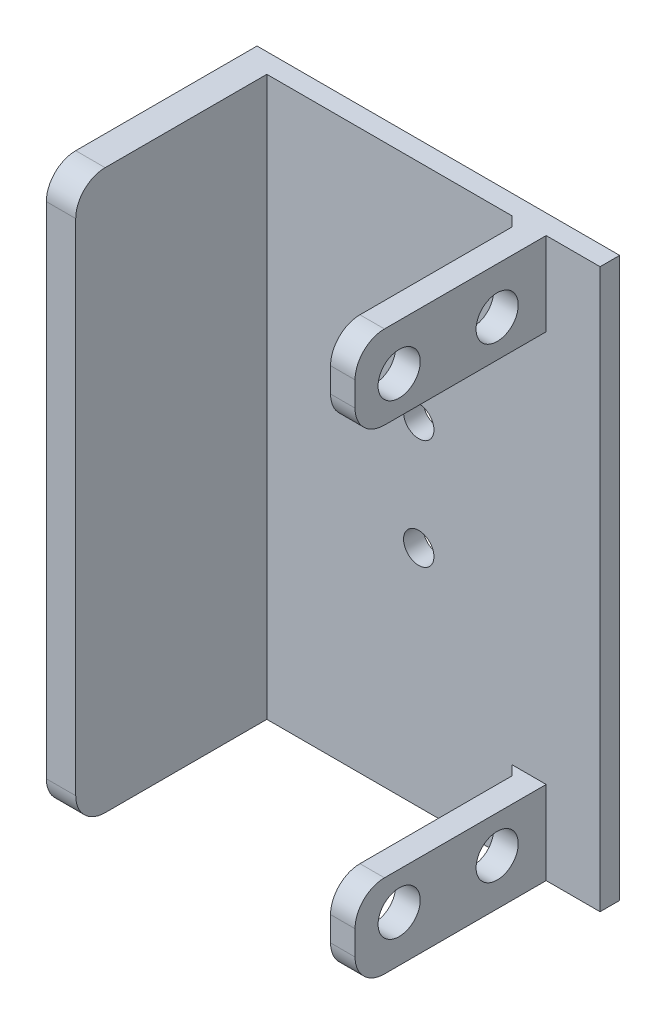
ISO-10303-21;
HEADER;
FILE_DESCRIPTION(('STEP AP214'),'2;1');
FILE_NAME('part.step','',(''),(''),'','','');
FILE_SCHEMA(('AUTOMOTIVE_DESIGN { 1 0 10303 214 1 1 1 1 }'));
ENDSEC;
DATA;
#1=APPLICATION_CONTEXT('core data for automotive mechanical design processes');
#2=APPLICATION_PROTOCOL_DEFINITION('international standard','automotive_design',2000,#1);
#3=PRODUCT_CONTEXT('',#1,'mechanical');
#4=PRODUCT('Part','Part','',(#3));
#5=PRODUCT_RELATED_PRODUCT_CATEGORY('part','',(#4));
#6=PRODUCT_DEFINITION_FORMATION('','',#4);
#7=PRODUCT_DEFINITION_CONTEXT('part definition',#1,'design');
#8=PRODUCT_DEFINITION('design','',#6,#7);
#9=PRODUCT_DEFINITION_SHAPE('','',#8);
#10=(LENGTH_UNIT() NAMED_UNIT(*) SI_UNIT(.MILLI.,.METRE.));
#11=(NAMED_UNIT(*) PLANE_ANGLE_UNIT() SI_UNIT($,.RADIAN.));
#12=(NAMED_UNIT(*) SI_UNIT($,.STERADIAN.) SOLID_ANGLE_UNIT());
#13=UNCERTAINTY_MEASURE_WITH_UNIT(LENGTH_MEASURE(1.E-05),#10,'distance_accuracy_value','');
#14=(GEOMETRIC_REPRESENTATION_CONTEXT(3) GLOBAL_UNCERTAINTY_ASSIGNED_CONTEXT((#13)) GLOBAL_UNIT_ASSIGNED_CONTEXT((#10,
#11,#12)) REPRESENTATION_CONTEXT('',''));
#15=CARTESIAN_POINT('',(0.,0.,0.));
#16=DIRECTION('',(0.,0.,1.));
#17=DIRECTION('',(1.,0.,0.));
#18=AXIS2_PLACEMENT_3D('',#15,#16,#17);
#19=CARTESIAN_POINT('',(0.,0.,2.));
#20=DIRECTION('',(0.,0.,1.));
#21=DIRECTION('',(1.,0.,0.));
#22=AXIS2_PLACEMENT_3D('',#19,#20,#21);
#23=PLANE('',#22);
#24=DIRECTION('',(1.,0.,0.));
#25=VECTOR('',#24,1.);
#26=CARTESIAN_POINT('',(-18.5,-28.5,2.));
#27=LINE('',#26,#25);
#28=CARTESIAN_POINT('',(-15.5,-28.5,2.));
#29=VERTEX_POINT('',#28);
#30=CARTESIAN_POINT('',(9.49999999999999,-28.5,2.));
#31=VERTEX_POINT('',#30);
#32=EDGE_CURVE('E218',#29,#31,#27,.T.);
#33=ORIENTED_EDGE('',*,*,#32,.T.);
#34=DIRECTION('',(0.,1.,0.));
#35=VECTOR('',#34,1.);
#36=CARTESIAN_POINT('',(9.49999999999999,0.,2.));
#37=LINE('',#36,#35);
#38=CARTESIAN_POINT('',(9.49999999999999,-20.,2.));
#39=VERTEX_POINT('',#38);
#40=EDGE_CURVE('E322',#31,#39,#37,.T.);
#41=ORIENTED_EDGE('',*,*,#40,.T.);
#42=DIRECTION('',(-1.,0.,0.));
#43=VECTOR('',#42,1.);
#44=CARTESIAN_POINT('',(13.,-20.,2.));
#45=LINE('',#44,#43);
#46=CARTESIAN_POINT('',(13.,-20.,2.));
#47=VERTEX_POINT('',#46);
#48=EDGE_CURVE('E211',#47,#39,#45,.T.);
#49=ORIENTED_EDGE('',*,*,#48,.F.);
#50=DIRECTION('',(0.,1.,0.));
#51=VECTOR('',#50,1.);
#52=CARTESIAN_POINT('',(13.,-28.5,2.));
#53=LINE('',#52,#51);
#54=CARTESIAN_POINT('',(13.,-28.5,2.));
#55=VERTEX_POINT('',#54);
#56=EDGE_CURVE('E194',#55,#47,#53,.T.);
#57=ORIENTED_EDGE('',*,*,#56,.F.);
#58=CARTESIAN_POINT('',(18.5,-28.5,2.));
#59=VERTEX_POINT('',#58);
#60=EDGE_CURVE('E208',#55,#59,#27,.T.);
#61=ORIENTED_EDGE('',*,*,#60,.T.);
#62=DIRECTION('',(0.,1.,0.));
#63=VECTOR('',#62,1.);
#64=CARTESIAN_POINT('',(18.5,28.5,2.));
#65=LINE('',#64,#63);
#66=CARTESIAN_POINT('',(18.5,28.5,2.));
#67=VERTEX_POINT('',#66);
#68=EDGE_CURVE('E238',#59,#67,#65,.T.);
#69=ORIENTED_EDGE('',*,*,#68,.T.);
#70=DIRECTION('',(-1.,0.,0.));
#71=VECTOR('',#70,1.);
#72=CARTESIAN_POINT('',(-18.5,28.5,2.));
#73=LINE('',#72,#71);
#74=CARTESIAN_POINT('',(13.,28.5,2.));
#75=VERTEX_POINT('',#74);
#76=EDGE_CURVE('E219',#67,#75,#73,.T.);
#77=ORIENTED_EDGE('',*,*,#76,.T.);
#78=DIRECTION('',(0.,1.,0.));
#79=VECTOR('',#78,1.);
#80=CARTESIAN_POINT('',(13.,28.5,2.));
#81=LINE('',#80,#79);
#82=CARTESIAN_POINT('',(13.,20.,2.));
#83=VERTEX_POINT('',#82);
#84=EDGE_CURVE('E376',#83,#75,#81,.T.);
#85=ORIENTED_EDGE('',*,*,#84,.F.);
#86=DIRECTION('',(1.,0.,0.));
#87=VECTOR('',#86,1.);
#88=CARTESIAN_POINT('',(10.5,20.,2.));
#89=LINE('',#88,#87);
#90=CARTESIAN_POINT('',(9.49999999999999,20.,2.));
#91=VERTEX_POINT('',#90);
#92=EDGE_CURVE('E334',#91,#83,#89,.T.);
#93=ORIENTED_EDGE('',*,*,#92,.F.);
#94=DIRECTION('',(0.,1.,0.));
#95=VECTOR('',#94,1.);
#96=CARTESIAN_POINT('',(9.5,0.,2.));
#97=LINE('',#96,#95);
#98=CARTESIAN_POINT('',(9.49999999999999,28.5,2.));
#99=VERTEX_POINT('',#98);
#100=EDGE_CURVE('E320',#91,#99,#97,.T.);
#101=ORIENTED_EDGE('',*,*,#100,.T.);
#102=CARTESIAN_POINT('',(-15.5,28.5,2.));
#103=VERTEX_POINT('',#102);
#104=EDGE_CURVE('E222',#99,#103,#73,.T.);
#105=ORIENTED_EDGE('',*,*,#104,.T.);
#106=DIRECTION('',(0.,1.,0.));
#107=VECTOR('',#106,1.);
#108=CARTESIAN_POINT('',(-15.5,28.5,2.));
#109=LINE('',#108,#107);
#110=EDGE_CURVE('E201',#29,#103,#109,.T.);
#111=ORIENTED_EDGE('',*,*,#110,.F.);
#112=EDGE_LOOP('',(#33,#41,#49,#57,#61,#69,#77,#85,#93,#101,#105,#111));
#113=FACE_BOUND('',#112,.T.);
#114=CARTESIAN_POINT('',(0.,-5.6,2.));
#115=DIRECTION('',(0.,0.,1.));
#116=DIRECTION('',(1.,0.,0.));
#117=AXIS2_PLACEMENT_3D('',#114,#115,#116);
#118=CIRCLE('',#117,1.55);
#119=CARTESIAN_POINT('',(1.55,-5.6,2.));
#120=VERTEX_POINT('',#119);
#121=EDGE_CURVE('E389',#120,#120,#118,.T.);
#122=ORIENTED_EDGE('',*,*,#121,.F.);
#123=EDGE_LOOP('',(#122));
#124=FACE_BOUND('',#123,.T.);
#125=CARTESIAN_POINT('',(0.,5.6,2.));
#126=DIRECTION('',(0.,0.,1.));
#127=DIRECTION('',(1.,0.,0.));
#128=AXIS2_PLACEMENT_3D('',#125,#126,#127);
#129=CIRCLE('',#128,1.55);
#130=CARTESIAN_POINT('',(1.55,5.6,2.));
#131=VERTEX_POINT('',#130);
#132=EDGE_CURVE('E392',#131,#131,#129,.F.);
#133=ORIENTED_EDGE('',*,*,#132,.T.);
#134=EDGE_LOOP('',(#133));
#135=FACE_BOUND('',#134,.T.);
#136=ADVANCED_FACE('F39',(#113,#124,#135),#23,.T.);
#137=CARTESIAN_POINT('',(0.,0.,0.));
#138=DIRECTION('',(0.,0.,1.));
#139=DIRECTION('',(1.,0.,0.));
#140=AXIS2_PLACEMENT_3D('',#137,#138,#139);
#141=PLANE('',#140);
#142=CARTESIAN_POINT('',(0.,-5.6,0.));
#143=DIRECTION('',(0.,0.,1.));
#144=DIRECTION('',(1.,0.,0.));
#145=AXIS2_PLACEMENT_3D('',#142,#143,#144);
#146=CIRCLE('',#145,1.55);
#147=CARTESIAN_POINT('',(1.55,-5.6,0.));
#148=VERTEX_POINT('',#147);
#149=EDGE_CURVE('E386',#148,#148,#146,.T.);
#150=ORIENTED_EDGE('',*,*,#149,.T.);
#151=EDGE_LOOP('',(#150));
#152=FACE_BOUND('',#151,.T.);
#153=DIRECTION('',(0.,1.,0.));
#154=VECTOR('',#153,1.);
#155=CARTESIAN_POINT('',(18.5,28.5,0.));
#156=LINE('',#155,#154);
#157=CARTESIAN_POINT('',(18.5,-28.5,0.));
#158=VERTEX_POINT('',#157);
#159=CARTESIAN_POINT('',(18.5,28.5,0.));
#160=VERTEX_POINT('',#159);
#161=EDGE_CURVE('E226',#158,#160,#156,.T.);
#162=ORIENTED_EDGE('',*,*,#161,.F.);
#163=DIRECTION('',(1.,0.,0.));
#164=VECTOR('',#163,1.);
#165=CARTESIAN_POINT('',(-18.5,-28.5,0.));
#166=LINE('',#165,#164);
#167=CARTESIAN_POINT('',(-18.5,-28.5,0.));
#168=VERTEX_POINT('',#167);
#169=EDGE_CURVE('E236',#168,#158,#166,.T.);
#170=ORIENTED_EDGE('',*,*,#169,.F.);
#171=DIRECTION('',(0.,-1.,0.));
#172=VECTOR('',#171,1.);
#173=CARTESIAN_POINT('',(-18.5,28.5,0.));
#174=LINE('',#173,#172);
#175=CARTESIAN_POINT('',(-18.5,28.5,0.));
#176=VERTEX_POINT('',#175);
#177=EDGE_CURVE('E233',#176,#168,#174,.T.);
#178=ORIENTED_EDGE('',*,*,#177,.F.);
#179=DIRECTION('',(-1.,0.,0.));
#180=VECTOR('',#179,1.);
#181=CARTESIAN_POINT('',(-18.5,28.5,0.));
#182=LINE('',#181,#180);
#183=EDGE_CURVE('E229',#160,#176,#182,.T.);
#184=ORIENTED_EDGE('',*,*,#183,.F.);
#185=EDGE_LOOP('',(#162,#170,#178,#184));
#186=FACE_BOUND('',#185,.T.);
#187=CARTESIAN_POINT('',(0.,5.6,0.));
#188=DIRECTION('',(0.,0.,1.));
#189=DIRECTION('',(1.,0.,0.));
#190=AXIS2_PLACEMENT_3D('',#187,#188,#189);
#191=CIRCLE('',#190,1.55);
#192=CARTESIAN_POINT('',(1.55,5.6,0.));
#193=VERTEX_POINT('',#192);
#194=EDGE_CURVE('E381',#193,#193,#191,.F.);
#195=ORIENTED_EDGE('',*,*,#194,.F.);
#196=EDGE_LOOP('',(#195));
#197=FACE_BOUND('',#196,.T.);
#198=ADVANCED_FACE('F469',(#152,#186,#197),#141,.F.);
#199=CARTESIAN_POINT('',(18.5,28.5,2.));
#200=DIRECTION('',(-1.,0.,0.));
#201=DIRECTION('',(0.,-1.,0.));
#202=AXIS2_PLACEMENT_3D('',#199,#200,#201);
#203=PLANE('',#202);
#204=ORIENTED_EDGE('',*,*,#161,.T.);
#205=DIRECTION('',(0.,0.,-1.));
#206=VECTOR('',#205,1.);
#207=CARTESIAN_POINT('',(18.5,28.5,2.));
#208=LINE('',#207,#206);
#209=EDGE_CURVE('E244',#67,#160,#208,.T.);
#210=ORIENTED_EDGE('',*,*,#209,.F.);
#211=ORIENTED_EDGE('',*,*,#68,.F.);
#212=DIRECTION('',(0.,0.,-1.));
#213=VECTOR('',#212,1.);
#214=CARTESIAN_POINT('',(18.5,-28.5,2.));
#215=LINE('',#214,#213);
#216=EDGE_CURVE('E216',#59,#158,#215,.T.);
#217=ORIENTED_EDGE('',*,*,#216,.T.);
#218=EDGE_LOOP('',(#204,#210,#211,#217));
#219=FACE_BOUND('',#218,.T.);
#220=ADVANCED_FACE('F472',(#219),#203,.F.);
#221=CARTESIAN_POINT('',(-18.5,28.5,2.));
#222=DIRECTION('',(0.,-1.,0.));
#223=DIRECTION('',(0.,0.,-1.));
#224=AXIS2_PLACEMENT_3D('',#221,#222,#223);
#225=PLANE('',#224);
#226=DIRECTION('',(0.,0.,-1.));
#227=VECTOR('',#226,1.);
#228=CARTESIAN_POINT('',(10.5,28.5,21.5));
#229=LINE('',#228,#227);
#230=CARTESIAN_POINT('',(10.5,28.5,18.5));
#231=VERTEX_POINT('',#230);
#232=CARTESIAN_POINT('',(10.5,28.5,3.00000000000002));
#233=VERTEX_POINT('',#232);
#234=EDGE_CURVE('E372',#231,#233,#229,.T.);
#235=ORIENTED_EDGE('',*,*,#234,.F.);
#236=DIRECTION('',(-1.,0.,0.));
#237=VECTOR('',#236,1.);
#238=CARTESIAN_POINT('',(-18.5,28.5,18.5));
#239=LINE('',#238,#237);
#240=CARTESIAN_POINT('',(13.,28.5,18.5));
#241=VERTEX_POINT('',#240);
#242=EDGE_CURVE('E276',#231,#241,#239,.F.);
#243=ORIENTED_EDGE('',*,*,#242,.T.);
#244=DIRECTION('',(0.,0.,-1.));
#245=VECTOR('',#244,1.);
#246=CARTESIAN_POINT('',(13.,28.5,21.5));
#247=LINE('',#246,#245);
#248=EDGE_CURVE('E370',#241,#75,#247,.T.);
#249=ORIENTED_EDGE('',*,*,#248,.T.);
#250=ORIENTED_EDGE('',*,*,#76,.F.);
#251=ORIENTED_EDGE('',*,*,#209,.T.);
#252=ORIENTED_EDGE('',*,*,#183,.T.);
#253=DIRECTION('',(0.,0.,-1.));
#254=VECTOR('',#253,1.);
#255=CARTESIAN_POINT('',(-18.5,28.5,2.));
#256=LINE('',#255,#254);
#257=CARTESIAN_POINT('',(-18.5,28.5,18.5));
#258=VERTEX_POINT('',#257);
#259=EDGE_CURVE('E242',#258,#176,#256,.T.);
#260=ORIENTED_EDGE('',*,*,#259,.F.);
#261=DIRECTION('',(-1.,0.,0.));
#262=VECTOR('',#261,1.);
#263=CARTESIAN_POINT('',(-15.5,28.5,18.5));
#264=LINE('',#263,#262);
#265=CARTESIAN_POINT('',(-15.5,28.5,18.5));
#266=VERTEX_POINT('',#265);
#267=EDGE_CURVE('E274',#258,#266,#264,.F.);
#268=ORIENTED_EDGE('',*,*,#267,.T.);
#269=DIRECTION('',(0.,0.,-1.));
#270=VECTOR('',#269,1.);
#271=CARTESIAN_POINT('',(-15.5,28.5,21.5));
#272=LINE('',#271,#270);
#273=EDGE_CURVE('E342',#266,#103,#272,.T.);
#274=ORIENTED_EDGE('',*,*,#273,.T.);
#275=ORIENTED_EDGE('',*,*,#104,.F.);
#276=DIRECTION('',(0.707106781186545,0.,0.70710678118655));
#277=VECTOR('',#276,1.);
#278=CARTESIAN_POINT('',(-4.49999999999989,28.5,-12.));
#279=LINE('',#278,#277);
#280=EDGE_CURVE('E11',#99,#233,#279,.T.);
#281=ORIENTED_EDGE('',*,*,#280,.T.);
#282=EDGE_LOOP('',(#235,#243,#249,#250,#251,#252,#260,#268,#274,#275,#281));
#283=FACE_BOUND('',#282,.T.);
#284=ADVANCED_FACE('F340',(#283),#225,.F.);
#285=CARTESIAN_POINT('',(-18.5,28.5,2.));
#286=DIRECTION('',(1.,0.,0.));
#287=DIRECTION('',(0.,1.,0.));
#288=AXIS2_PLACEMENT_3D('',#285,#286,#287);
#289=PLANE('',#288);
#290=CARTESIAN_POINT('',(-18.5,-9.9,11.5));
#291=DIRECTION('',(1.,0.,0.));
#292=DIRECTION('',(0.,1.,0.));
#293=AXIS2_PLACEMENT_3D('',#290,#291,#292);
#294=CIRCLE('',#293,2.5);
#295=CARTESIAN_POINT('',(-18.5,-7.4,11.5));
#296=VERTEX_POINT('',#295);
#297=EDGE_CURVE('E247',#296,#296,#294,.F.);
#298=ORIENTED_EDGE('',*,*,#297,.F.);
#299=EDGE_LOOP('',(#298));
#300=FACE_BOUND('',#299,.T.);
#301=DIRECTION('',(0.,0.,-1.));
#302=VECTOR('',#301,1.);
#303=CARTESIAN_POINT('',(-18.5,-28.5,2.));
#304=LINE('',#303,#302);
#305=CARTESIAN_POINT('',(-18.5,-28.5,18.5));
#306=VERTEX_POINT('',#305);
#307=EDGE_CURVE('E240',#306,#168,#304,.T.);
#308=ORIENTED_EDGE('',*,*,#307,.F.);
#309=CARTESIAN_POINT('',(-18.5,-25.5,18.5));
#310=DIRECTION('',(1.,0.,0.));
#311=DIRECTION('',(0.,1.,0.));
#312=AXIS2_PLACEMENT_3D('',#309,#310,#311);
#313=CIRCLE('',#312,3.);
#314=CARTESIAN_POINT('',(-18.5,-25.5,21.5));
#315=VERTEX_POINT('',#314);
#316=EDGE_CURVE('E315',#306,#315,#313,.F.);
#317=ORIENTED_EDGE('',*,*,#316,.T.);
#318=DIRECTION('',(0.,-1.,0.));
#319=VECTOR('',#318,1.);
#320=CARTESIAN_POINT('',(-18.5,28.5,21.5));
#321=LINE('',#320,#319);
#322=CARTESIAN_POINT('',(-18.5,25.5,21.5));
#323=VERTEX_POINT('',#322);
#324=EDGE_CURVE('E350',#323,#315,#321,.T.);
#325=ORIENTED_EDGE('',*,*,#324,.F.);
#326=CARTESIAN_POINT('',(-18.5,25.5,18.5));
#327=DIRECTION('',(1.,0.,0.));
#328=DIRECTION('',(0.,1.,0.));
#329=AXIS2_PLACEMENT_3D('',#326,#327,#328);
#330=CIRCLE('',#329,3.);
#331=EDGE_CURVE('E313',#323,#258,#330,.F.);
#332=ORIENTED_EDGE('',*,*,#331,.T.);
#333=ORIENTED_EDGE('',*,*,#259,.T.);
#334=ORIENTED_EDGE('',*,*,#177,.T.);
#335=EDGE_LOOP('',(#308,#317,#325,#332,#333,#334));
#336=FACE_BOUND('',#335,.T.);
#337=ADVANCED_FACE('F458',(#300,#336),#289,.F.);
#338=CARTESIAN_POINT('',(-18.5,-28.5,2.));
#339=DIRECTION('',(0.,1.,0.));
#340=DIRECTION('',(0.,0.,1.));
#341=AXIS2_PLACEMENT_3D('',#338,#339,#340);
#342=PLANE('',#341);
#343=DIRECTION('',(0.,0.,-1.));
#344=VECTOR('',#343,1.);
#345=CARTESIAN_POINT('',(13.,-28.5,21.5));
#346=LINE('',#345,#344);
#347=CARTESIAN_POINT('',(13.,-28.5,18.5));
#348=VERTEX_POINT('',#347);
#349=EDGE_CURVE('E190',#348,#55,#346,.T.);
#350=ORIENTED_EDGE('',*,*,#349,.F.);
#351=DIRECTION('',(1.,0.,0.));
#352=VECTOR('',#351,1.);
#353=CARTESIAN_POINT('',(10.5,-28.5,18.5));
#354=LINE('',#353,#352);
#355=CARTESIAN_POINT('',(10.5,-28.5,18.5));
#356=VERTEX_POINT('',#355);
#357=EDGE_CURVE('E301',#348,#356,#354,.F.);
#358=ORIENTED_EDGE('',*,*,#357,.T.);
#359=DIRECTION('',(0.,0.,-1.));
#360=VECTOR('',#359,1.);
#361=CARTESIAN_POINT('',(10.5,-28.5,21.5));
#362=LINE('',#361,#360);
#363=CARTESIAN_POINT('',(10.5,-28.5,3.00000000000002));
#364=VERTEX_POINT('',#363);
#365=EDGE_CURVE('E359',#356,#364,#362,.T.);
#366=ORIENTED_EDGE('',*,*,#365,.T.);
#367=DIRECTION('',(-0.707106781186545,0.,-0.70710678118655));
#368=VECTOR('',#367,1.);
#369=CARTESIAN_POINT('',(-4.49999999999992,-28.5,-12.));
#370=LINE('',#369,#368);
#371=EDGE_CURVE('E326',#364,#31,#370,.T.);
#372=ORIENTED_EDGE('',*,*,#371,.T.);
#373=ORIENTED_EDGE('',*,*,#32,.F.);
#374=DIRECTION('',(0.,0.,-1.));
#375=VECTOR('',#374,1.);
#376=CARTESIAN_POINT('',(-15.5,-28.5,21.5));
#377=LINE('',#376,#375);
#378=CARTESIAN_POINT('',(-15.5,-28.5,18.5));
#379=VERTEX_POINT('',#378);
#380=EDGE_CURVE('E230',#379,#29,#377,.T.);
#381=ORIENTED_EDGE('',*,*,#380,.F.);
#382=DIRECTION('',(1.,0.,0.));
#383=VECTOR('',#382,1.);
#384=CARTESIAN_POINT('',(-18.5,-28.5,18.5));
#385=LINE('',#384,#383);
#386=EDGE_CURVE('E299',#379,#306,#385,.F.);
#387=ORIENTED_EDGE('',*,*,#386,.T.);
#388=ORIENTED_EDGE('',*,*,#307,.T.);
#389=ORIENTED_EDGE('',*,*,#169,.T.);
#390=ORIENTED_EDGE('',*,*,#216,.F.);
#391=ORIENTED_EDGE('',*,*,#60,.F.);
#392=EDGE_LOOP('',(#350,#358,#366,#372,#373,#381,#387,#388,#389,#390,#391));
#393=FACE_BOUND('',#392,.T.);
#394=ADVANCED_FACE('F214',(#393),#342,.F.);
#395=CARTESIAN_POINT('',(-15.5,28.5,21.5));
#396=DIRECTION('',(-1.,0.,0.));
#397=DIRECTION('',(0.,-1.,0.));
#398=AXIS2_PLACEMENT_3D('',#395,#396,#397);
#399=PLANE('',#398);
#400=DIRECTION('',(0.,1.,0.));
#401=VECTOR('',#400,1.);
#402=CARTESIAN_POINT('',(-15.5,28.5,21.5));
#403=LINE('',#402,#401);
#404=CARTESIAN_POINT('',(-15.5,-25.5,21.5));
#405=VERTEX_POINT('',#404);
#406=CARTESIAN_POINT('',(-15.5,25.5,21.5));
#407=VERTEX_POINT('',#406);
#408=EDGE_CURVE('E348',#405,#407,#403,.T.);
#409=ORIENTED_EDGE('',*,*,#408,.F.);
#410=CARTESIAN_POINT('',(-15.5,-25.5,18.5));
#411=DIRECTION('',(-1.,0.,0.));
#412=DIRECTION('',(0.,-1.,0.));
#413=AXIS2_PLACEMENT_3D('',#410,#411,#412);
#414=CIRCLE('',#413,3.);
#415=EDGE_CURVE('E311',#405,#379,#414,.F.);
#416=ORIENTED_EDGE('',*,*,#415,.T.);
#417=ORIENTED_EDGE('',*,*,#380,.T.);
#418=ORIENTED_EDGE('',*,*,#110,.T.);
#419=ORIENTED_EDGE('',*,*,#273,.F.);
#420=CARTESIAN_POINT('',(-15.5,25.5,18.5));
#421=DIRECTION('',(-1.,0.,0.));
#422=DIRECTION('',(0.,-1.,0.));
#423=AXIS2_PLACEMENT_3D('',#420,#421,#422);
#424=CIRCLE('',#423,3.);
#425=EDGE_CURVE('E309',#266,#407,#424,.F.);
#426=ORIENTED_EDGE('',*,*,#425,.T.);
#427=EDGE_LOOP('',(#409,#416,#417,#418,#419,#426));
#428=FACE_BOUND('',#427,.T.);
#429=ADVANCED_FACE('F448',(#428),#399,.F.);
#430=CARTESIAN_POINT('',(0.,0.,21.5));
#431=DIRECTION('',(0.,0.,1.));
#432=DIRECTION('',(1.,0.,0.));
#433=AXIS2_PLACEMENT_3D('',#430,#431,#432);
#434=PLANE('',#433);
#435=ORIENTED_EDGE('',*,*,#324,.T.);
#436=DIRECTION('',(1.,0.,0.));
#437=VECTOR('',#436,1.);
#438=CARTESIAN_POINT('',(-15.5,-25.5,21.5));
#439=LINE('',#438,#437);
#440=EDGE_CURVE('E306',#315,#405,#439,.T.);
#441=ORIENTED_EDGE('',*,*,#440,.T.);
#442=ORIENTED_EDGE('',*,*,#408,.T.);
#443=DIRECTION('',(-1.,0.,0.));
#444=VECTOR('',#443,1.);
#445=CARTESIAN_POINT('',(-18.5,25.5,21.5));
#446=LINE('',#445,#444);
#447=EDGE_CURVE('E303',#407,#323,#446,.T.);
#448=ORIENTED_EDGE('',*,*,#447,.T.);
#449=EDGE_LOOP('',(#435,#441,#442,#448));
#450=FACE_BOUND('',#449,.T.);
#451=ADVANCED_FACE('F417',(#450),#434,.T.);
#452=CARTESIAN_POINT('',(13.,-28.5,21.5));
#453=DIRECTION('',(-1.,0.,0.));
#454=DIRECTION('',(0.,0.,1.));
#455=AXIS2_PLACEMENT_3D('',#452,#453,#454);
#456=PLANE('',#455);
#457=CARTESIAN_POINT('',(13.,-23.7930445351537,7.));
#458=DIRECTION('',(1.,0.,0.));
#459=DIRECTION('',(0.,0.,-1.));
#460=AXIS2_PLACEMENT_3D('',#457,#458,#459);
#461=CIRCLE('',#460,2.15);
#462=CARTESIAN_POINT('',(13.,-23.7930445351537,4.85));
#463=VERTEX_POINT('',#462);
#464=EDGE_CURVE('E401',#463,#463,#461,.T.);
#465=ORIENTED_EDGE('',*,*,#464,.F.);
#466=EDGE_LOOP('',(#465));
#467=FACE_BOUND('',#466,.T.);
#468=CARTESIAN_POINT('',(13.,-23.7930445351537,17.));
#469=DIRECTION('',(1.,0.,0.));
#470=DIRECTION('',(0.,0.,-1.));
#471=AXIS2_PLACEMENT_3D('',#468,#469,#470);
#472=CIRCLE('',#471,2.15);
#473=CARTESIAN_POINT('',(13.,-23.7930445351537,14.85));
#474=VERTEX_POINT('',#473);
#475=EDGE_CURVE('E255',#474,#474,#472,.T.);
#476=ORIENTED_EDGE('',*,*,#475,.F.);
#477=EDGE_LOOP('',(#476));
#478=FACE_BOUND('',#477,.T.);
#479=DIRECTION('',(0.,0.,-1.));
#480=VECTOR('',#479,1.);
#481=CARTESIAN_POINT('',(13.,-20.,21.5));
#482=LINE('',#481,#480);
#483=CARTESIAN_POINT('',(13.,-20.,18.5));
#484=VERTEX_POINT('',#483);
#485=EDGE_CURVE('E202',#484,#47,#482,.T.);
#486=ORIENTED_EDGE('',*,*,#485,.F.);
#487=CARTESIAN_POINT('',(13.,-23.,18.5));
#488=DIRECTION('',(-1.,0.,0.));
#489=DIRECTION('',(0.,0.,1.));
#490=AXIS2_PLACEMENT_3D('',#487,#488,#489);
#491=CIRCLE('',#490,3.);
#492=CARTESIAN_POINT('',(13.,-23.,21.5));
#493=VERTEX_POINT('',#492);
#494=EDGE_CURVE('E295',#484,#493,#491,.F.);
#495=ORIENTED_EDGE('',*,*,#494,.T.);
#496=DIRECTION('',(0.,1.,0.));
#497=VECTOR('',#496,1.);
#498=CARTESIAN_POINT('',(13.,-28.5,21.5));
#499=LINE('',#498,#497);
#500=CARTESIAN_POINT('',(13.,-25.5,21.5));
#501=VERTEX_POINT('',#500);
#502=EDGE_CURVE('E363',#501,#493,#499,.T.);
#503=ORIENTED_EDGE('',*,*,#502,.F.);
#504=CARTESIAN_POINT('',(13.,-25.5,18.5));
#505=DIRECTION('',(-1.,0.,0.));
#506=DIRECTION('',(0.,0.,1.));
#507=AXIS2_PLACEMENT_3D('',#504,#505,#506);
#508=CIRCLE('',#507,3.);
#509=EDGE_CURVE('E197',#501,#348,#508,.F.);
#510=ORIENTED_EDGE('',*,*,#509,.T.);
#511=ORIENTED_EDGE('',*,*,#349,.T.);
#512=ORIENTED_EDGE('',*,*,#56,.T.);
#513=EDGE_LOOP('',(#486,#495,#503,#510,#511,#512));
#514=FACE_BOUND('',#513,.T.);
#515=ADVANCED_FACE('F193',(#467,#478,#514),#456,.F.);
#516=CARTESIAN_POINT('',(13.,-20.,21.5));
#517=DIRECTION('',(0.,-1.,0.));
#518=DIRECTION('',(0.,0.,-1.));
#519=AXIS2_PLACEMENT_3D('',#516,#517,#518);
#520=PLANE('',#519);
#521=DIRECTION('',(0.,0.,-1.));
#522=VECTOR('',#521,1.);
#523=CARTESIAN_POINT('',(10.5,-20.,21.5));
#524=LINE('',#523,#522);
#525=CARTESIAN_POINT('',(10.5,-20.,18.5));
#526=VERTEX_POINT('',#525);
#527=CARTESIAN_POINT('',(10.5,-20.,3.00000000000002));
#528=VERTEX_POINT('',#527);
#529=EDGE_CURVE('E356',#526,#528,#524,.T.);
#530=ORIENTED_EDGE('',*,*,#529,.F.);
#531=DIRECTION('',(-1.,0.,0.));
#532=VECTOR('',#531,1.);
#533=CARTESIAN_POINT('',(13.,-20.,18.5));
#534=LINE('',#533,#532);
#535=EDGE_CURVE('E292',#526,#484,#534,.F.);
#536=ORIENTED_EDGE('',*,*,#535,.T.);
#537=ORIENTED_EDGE('',*,*,#485,.T.);
#538=ORIENTED_EDGE('',*,*,#48,.T.);
#539=DIRECTION('',(0.707106781186545,0.,0.70710678118655));
#540=VECTOR('',#539,1.);
#541=CARTESIAN_POINT('',(21.,-20.,13.5000000000001));
#542=LINE('',#541,#540);
#543=EDGE_CURVE('E328',#39,#528,#542,.T.);
#544=ORIENTED_EDGE('',*,*,#543,.T.);
#545=EDGE_LOOP('',(#530,#536,#537,#538,#544));
#546=FACE_BOUND('',#545,.T.);
#547=ADVANCED_FACE('F416',(#546),#520,.F.);
#548=CARTESIAN_POINT('',(10.5,-20.,21.5));
#549=DIRECTION('',(1.,0.,0.));
#550=DIRECTION('',(0.,1.,0.));
#551=AXIS2_PLACEMENT_3D('',#548,#549,#550);
#552=PLANE('',#551);
#553=CARTESIAN_POINT('',(10.5,-23.7930445351537,7.));
#554=DIRECTION('',(1.,0.,0.));
#555=DIRECTION('',(0.,1.,0.));
#556=AXIS2_PLACEMENT_3D('',#553,#554,#555);
#557=CIRCLE('',#556,2.15);
#558=CARTESIAN_POINT('',(10.5,-21.6430445351537,7.));
#559=VERTEX_POINT('',#558);
#560=EDGE_CURVE('E261',#559,#559,#557,.T.);
#561=ORIENTED_EDGE('',*,*,#560,.T.);
#562=EDGE_LOOP('',(#561));
#563=FACE_BOUND('',#562,.T.);
#564=CARTESIAN_POINT('',(10.5,-23.7930445351537,17.));
#565=DIRECTION('',(1.,0.,0.));
#566=DIRECTION('',(0.,1.,0.));
#567=AXIS2_PLACEMENT_3D('',#564,#565,#566);
#568=CIRCLE('',#567,2.15);
#569=CARTESIAN_POINT('',(10.5,-21.6430445351537,17.));
#570=VERTEX_POINT('',#569);
#571=EDGE_CURVE('E258',#570,#570,#568,.T.);
#572=ORIENTED_EDGE('',*,*,#571,.T.);
#573=EDGE_LOOP('',(#572));
#574=FACE_BOUND('',#573,.T.);
#575=ORIENTED_EDGE('',*,*,#529,.T.);
#576=DIRECTION('',(0.,-1.,0.));
#577=VECTOR('',#576,1.);
#578=CARTESIAN_POINT('',(10.5,-20.,3.00000000000002));
#579=LINE('',#578,#577);
#580=EDGE_CURVE('E317',#528,#364,#579,.T.);
#581=ORIENTED_EDGE('',*,*,#580,.T.);
#582=ORIENTED_EDGE('',*,*,#365,.F.);
#583=CARTESIAN_POINT('',(10.5,-25.5,18.5));
#584=DIRECTION('',(1.,0.,0.));
#585=DIRECTION('',(0.,1.,0.));
#586=AXIS2_PLACEMENT_3D('',#583,#584,#585);
#587=CIRCLE('',#586,3.);
#588=CARTESIAN_POINT('',(10.5,-25.5,21.5));
#589=VERTEX_POINT('',#588);
#590=EDGE_CURVE('E288',#356,#589,#587,.F.);
#591=ORIENTED_EDGE('',*,*,#590,.T.);
#592=DIRECTION('',(0.,-1.,0.));
#593=VECTOR('',#592,1.);
#594=CARTESIAN_POINT('',(10.5,-20.,21.5));
#595=LINE('',#594,#593);
#596=CARTESIAN_POINT('',(10.5,-23.,21.5));
#597=VERTEX_POINT('',#596);
#598=EDGE_CURVE('E362',#597,#589,#595,.T.);
#599=ORIENTED_EDGE('',*,*,#598,.F.);
#600=CARTESIAN_POINT('',(10.5,-23.,18.5));
#601=DIRECTION('',(1.,0.,0.));
#602=DIRECTION('',(0.,1.,0.));
#603=AXIS2_PLACEMENT_3D('',#600,#601,#602);
#604=CIRCLE('',#603,3.);
#605=EDGE_CURVE('E290',#597,#526,#604,.F.);
#606=ORIENTED_EDGE('',*,*,#605,.T.);
#607=EDGE_LOOP('',(#575,#581,#582,#591,#599,#606));
#608=FACE_BOUND('',#607,.T.);
#609=ADVANCED_FACE('F428',(#563,#574,#608),#552,.F.);
#610=CARTESIAN_POINT('',(0.,0.,21.5));
#611=DIRECTION('',(0.,0.,1.));
#612=DIRECTION('',(1.,0.,0.));
#613=AXIS2_PLACEMENT_3D('',#610,#611,#612);
#614=PLANE('',#613);
#615=ORIENTED_EDGE('',*,*,#502,.T.);
#616=DIRECTION('',(-1.,0.,0.));
#617=VECTOR('',#616,1.);
#618=CARTESIAN_POINT('',(10.5,-23.,21.5));
#619=LINE('',#618,#617);
#620=EDGE_CURVE('E285',#493,#597,#619,.T.);
#621=ORIENTED_EDGE('',*,*,#620,.T.);
#622=ORIENTED_EDGE('',*,*,#598,.T.);
#623=DIRECTION('',(1.,0.,0.));
#624=VECTOR('',#623,1.);
#625=CARTESIAN_POINT('',(13.,-25.5,21.5));
#626=LINE('',#625,#624);
#627=EDGE_CURVE('E282',#589,#501,#626,.T.);
#628=ORIENTED_EDGE('',*,*,#627,.T.);
#629=EDGE_LOOP('',(#615,#621,#622,#628));
#630=FACE_BOUND('',#629,.T.);
#631=ADVANCED_FACE('F431',(#630),#614,.T.);
#632=CARTESIAN_POINT('',(10.5,20.,21.5));
#633=DIRECTION('',(0.,1.,0.));
#634=DIRECTION('',(0.,0.,1.));
#635=AXIS2_PLACEMENT_3D('',#632,#633,#634);
#636=PLANE('',#635);
#637=DIRECTION('',(0.,0.,-1.));
#638=VECTOR('',#637,1.);
#639=CARTESIAN_POINT('',(13.,20.,21.5));
#640=LINE('',#639,#638);
#641=CARTESIAN_POINT('',(13.,20.,18.5));
#642=VERTEX_POINT('',#641);
#643=EDGE_CURVE('E212',#642,#83,#640,.T.);
#644=ORIENTED_EDGE('',*,*,#643,.F.);
#645=DIRECTION('',(1.,0.,0.));
#646=VECTOR('',#645,1.);
#647=CARTESIAN_POINT('',(10.5,20.,18.5));
#648=LINE('',#647,#646);
#649=CARTESIAN_POINT('',(10.5,20.,18.5));
#650=VERTEX_POINT('',#649);
#651=EDGE_CURVE('E297',#642,#650,#648,.F.);
#652=ORIENTED_EDGE('',*,*,#651,.T.);
#653=DIRECTION('',(0.,0.,-1.));
#654=VECTOR('',#653,1.);
#655=CARTESIAN_POINT('',(10.5,20.,21.5));
#656=LINE('',#655,#654);
#657=CARTESIAN_POINT('',(10.5,20.,3.00000000000002));
#658=VERTEX_POINT('',#657);
#659=EDGE_CURVE('E336',#650,#658,#656,.T.);
#660=ORIENTED_EDGE('',*,*,#659,.T.);
#661=DIRECTION('',(-0.707106781186545,0.,-0.70710678118655));
#662=VECTOR('',#661,1.);
#663=CARTESIAN_POINT('',(19.75,20.,12.2500000000001));
#664=LINE('',#663,#662);
#665=EDGE_CURVE('E48',#658,#91,#664,.T.);
#666=ORIENTED_EDGE('',*,*,#665,.T.);
#667=ORIENTED_EDGE('',*,*,#92,.T.);
#668=EDGE_LOOP('',(#644,#652,#660,#666,#667));
#669=FACE_BOUND('',#668,.T.);
#670=ADVANCED_FACE('F333',(#669),#636,.F.);
#671=CARTESIAN_POINT('',(13.,28.5,21.5));
#672=DIRECTION('',(-1.,0.,0.));
#673=DIRECTION('',(0.,0.,1.));
#674=AXIS2_PLACEMENT_3D('',#671,#672,#673);
#675=PLANE('',#674);
#676=CARTESIAN_POINT('',(13.,23.7930445351537,17.));
#677=DIRECTION('',(1.,0.,0.));
#678=DIRECTION('',(0.,0.,1.));
#679=AXIS2_PLACEMENT_3D('',#676,#677,#678);
#680=CIRCLE('',#679,2.14999999999999);
#681=CARTESIAN_POINT('',(13.,23.7930445351537,19.15));
#682=VERTEX_POINT('',#681);
#683=EDGE_CURVE('E402',#682,#682,#680,.T.);
#684=ORIENTED_EDGE('',*,*,#683,.F.);
#685=EDGE_LOOP('',(#684));
#686=FACE_BOUND('',#685,.T.);
#687=CARTESIAN_POINT('',(13.,23.7930445351537,7.));
#688=DIRECTION('',(1.,0.,0.));
#689=DIRECTION('',(0.,0.,1.));
#690=AXIS2_PLACEMENT_3D('',#687,#688,#689);
#691=CIRCLE('',#690,2.15);
#692=CARTESIAN_POINT('',(13.,23.7930445351537,9.15));
#693=VERTEX_POINT('',#692);
#694=EDGE_CURVE('E405',#693,#693,#691,.T.);
#695=ORIENTED_EDGE('',*,*,#694,.F.);
#696=EDGE_LOOP('',(#695));
#697=FACE_BOUND('',#696,.T.);
#698=ORIENTED_EDGE('',*,*,#248,.F.);
#699=CARTESIAN_POINT('',(13.,25.5,18.5));
#700=DIRECTION('',(-1.,0.,0.));
#701=DIRECTION('',(0.,0.,1.));
#702=AXIS2_PLACEMENT_3D('',#699,#700,#701);
#703=CIRCLE('',#702,3.);
#704=CARTESIAN_POINT('',(13.,25.5,21.5));
#705=VERTEX_POINT('',#704);
#706=EDGE_CURVE('E280',#241,#705,#703,.F.);
#707=ORIENTED_EDGE('',*,*,#706,.T.);
#708=DIRECTION('',(0.,1.,0.));
#709=VECTOR('',#708,1.);
#710=CARTESIAN_POINT('',(13.,28.5,21.5));
#711=LINE('',#710,#709);
#712=CARTESIAN_POINT('',(13.,23.,21.5));
#713=VERTEX_POINT('',#712);
#714=EDGE_CURVE('E379',#713,#705,#711,.T.);
#715=ORIENTED_EDGE('',*,*,#714,.F.);
#716=CARTESIAN_POINT('',(13.,23.,18.5));
#717=DIRECTION('',(-1.,0.,0.));
#718=DIRECTION('',(0.,0.,1.));
#719=AXIS2_PLACEMENT_3D('',#716,#717,#718);
#720=CIRCLE('',#719,3.);
#721=EDGE_CURVE('E278',#713,#642,#720,.F.);
#722=ORIENTED_EDGE('',*,*,#721,.T.);
#723=ORIENTED_EDGE('',*,*,#643,.T.);
#724=ORIENTED_EDGE('',*,*,#84,.T.);
#725=EDGE_LOOP('',(#698,#707,#715,#722,#723,#724));
#726=FACE_BOUND('',#725,.T.);
#727=ADVANCED_FACE('F526',(#686,#697,#726),#675,.F.);
#728=CARTESIAN_POINT('',(10.5,20.,21.5));
#729=DIRECTION('',(1.,0.,0.));
#730=DIRECTION('',(0.,1.,0.));
#731=AXIS2_PLACEMENT_3D('',#728,#729,#730);
#732=PLANE('',#731);
#733=CARTESIAN_POINT('',(10.5,23.7930445351537,17.));
#734=DIRECTION('',(1.,0.,0.));
#735=DIRECTION('',(0.,1.,0.));
#736=AXIS2_PLACEMENT_3D('',#733,#734,#735);
#737=CIRCLE('',#736,2.14999999999999);
#738=CARTESIAN_POINT('',(10.5,25.9430445351537,17.));
#739=VERTEX_POINT('',#738);
#740=EDGE_CURVE('E254',#739,#739,#737,.T.);
#741=ORIENTED_EDGE('',*,*,#740,.T.);
#742=EDGE_LOOP('',(#741));
#743=FACE_BOUND('',#742,.T.);
#744=CARTESIAN_POINT('',(10.5,23.7930445351537,7.));
#745=DIRECTION('',(1.,0.,0.));
#746=DIRECTION('',(0.,1.,0.));
#747=AXIS2_PLACEMENT_3D('',#744,#745,#746);
#748=CIRCLE('',#747,2.15);
#749=CARTESIAN_POINT('',(10.5,25.9430445351537,7.));
#750=VERTEX_POINT('',#749);
#751=EDGE_CURVE('E251',#750,#750,#748,.T.);
#752=ORIENTED_EDGE('',*,*,#751,.T.);
#753=EDGE_LOOP('',(#752));
#754=FACE_BOUND('',#753,.T.);
#755=ORIENTED_EDGE('',*,*,#234,.T.);
#756=DIRECTION('',(0.,-1.,0.));
#757=VECTOR('',#756,1.);
#758=CARTESIAN_POINT('',(10.5,20.,3.00000000000002));
#759=LINE('',#758,#757);
#760=EDGE_CURVE('E324',#233,#658,#759,.T.);
#761=ORIENTED_EDGE('',*,*,#760,.T.);
#762=ORIENTED_EDGE('',*,*,#659,.F.);
#763=CARTESIAN_POINT('',(10.5,23.,18.5));
#764=DIRECTION('',(1.,0.,0.));
#765=DIRECTION('',(0.,1.,0.));
#766=AXIS2_PLACEMENT_3D('',#763,#764,#765);
#767=CIRCLE('',#766,3.);
#768=CARTESIAN_POINT('',(10.5,23.,21.5));
#769=VERTEX_POINT('',#768);
#770=EDGE_CURVE('E270',#650,#769,#767,.F.);
#771=ORIENTED_EDGE('',*,*,#770,.T.);
#772=DIRECTION('',(0.,-1.,0.));
#773=VECTOR('',#772,1.);
#774=CARTESIAN_POINT('',(10.5,20.,21.5));
#775=LINE('',#774,#773);
#776=CARTESIAN_POINT('',(10.5,25.5,21.5));
#777=VERTEX_POINT('',#776);
#778=EDGE_CURVE('E375',#777,#769,#775,.T.);
#779=ORIENTED_EDGE('',*,*,#778,.F.);
#780=CARTESIAN_POINT('',(10.5,25.5,18.5));
#781=DIRECTION('',(1.,0.,0.));
#782=DIRECTION('',(0.,1.,0.));
#783=AXIS2_PLACEMENT_3D('',#780,#781,#782);
#784=CIRCLE('',#783,3.);
#785=EDGE_CURVE('E272',#777,#231,#784,.F.);
#786=ORIENTED_EDGE('',*,*,#785,.T.);
#787=EDGE_LOOP('',(#755,#761,#762,#771,#779,#786));
#788=FACE_BOUND('',#787,.T.);
#789=ADVANCED_FACE('F522',(#743,#754,#788),#732,.F.);
#790=CARTESIAN_POINT('',(0.,0.,21.5));
#791=DIRECTION('',(0.,0.,-1.));
#792=DIRECTION('',(-1.,0.,0.));
#793=AXIS2_PLACEMENT_3D('',#790,#791,#792);
#794=PLANE('',#793);
#795=ORIENTED_EDGE('',*,*,#714,.T.);
#796=DIRECTION('',(-1.,0.,0.));
#797=VECTOR('',#796,1.);
#798=CARTESIAN_POINT('',(0.,25.5,21.5));
#799=LINE('',#798,#797);
#800=EDGE_CURVE('E267',#705,#777,#799,.T.);
#801=ORIENTED_EDGE('',*,*,#800,.T.);
#802=ORIENTED_EDGE('',*,*,#778,.T.);
#803=DIRECTION('',(1.,0.,0.));
#804=VECTOR('',#803,1.);
#805=CARTESIAN_POINT('',(0.,23.,21.5));
#806=LINE('',#805,#804);
#807=EDGE_CURVE('E250',#769,#713,#806,.T.);
#808=ORIENTED_EDGE('',*,*,#807,.T.);
#809=EDGE_LOOP('',(#795,#801,#802,#808));
#810=FACE_BOUND('',#809,.T.);
#811=ADVANCED_FACE('F518',(#810),#794,.F.);
#812=CARTESIAN_POINT('',(0.,-5.6,0.));
#813=DIRECTION('',(0.,0.,1.));
#814=DIRECTION('',(1.,0.,0.));
#815=AXIS2_PLACEMENT_3D('',#812,#813,#814);
#816=CYLINDRICAL_SURFACE('',#815,1.55);
#817=ORIENTED_EDGE('',*,*,#149,.F.);
#818=EDGE_LOOP('',(#817));
#819=FACE_BOUND('',#818,.T.);
#820=ORIENTED_EDGE('',*,*,#121,.T.);
#821=EDGE_LOOP('',(#820));
#822=FACE_BOUND('',#821,.T.);
#823=ADVANCED_FACE('F511',(#819,#822),#816,.F.);
#824=CARTESIAN_POINT('',(0.,5.6,0.));
#825=DIRECTION('',(0.,0.,1.));
#826=DIRECTION('',(1.,0.,0.));
#827=AXIS2_PLACEMENT_3D('',#824,#825,#826);
#828=CYLINDRICAL_SURFACE('',#827,1.55);
#829=ORIENTED_EDGE('',*,*,#194,.T.);
#830=EDGE_LOOP('',(#829));
#831=FACE_BOUND('',#830,.T.);
#832=ORIENTED_EDGE('',*,*,#132,.F.);
#833=EDGE_LOOP('',(#832));
#834=FACE_BOUND('',#833,.T.);
#835=ADVANCED_FACE('F501',(#831,#834),#828,.F.);
#836=CARTESIAN_POINT('',(-21.5,-9.9,11.5));
#837=DIRECTION('',(1.,0.,0.));
#838=DIRECTION('',(0.,1.,0.));
#839=AXIS2_PLACEMENT_3D('',#836,#837,#838);
#840=CYLINDRICAL_SURFACE('',#839,2.5);
#841=CARTESIAN_POINT('',(-21.5,-9.9,11.5));
#842=DIRECTION('',(-1.,0.,0.));
#843=DIRECTION('',(0.,-1.,0.));
#844=AXIS2_PLACEMENT_3D('',#841,#842,#843);
#845=CIRCLE('',#844,2.5);
#846=CARTESIAN_POINT('',(-21.5,-12.4,11.5));
#847=VERTEX_POINT('',#846);
#848=EDGE_CURVE('E264',#847,#847,#845,.T.);
#849=ORIENTED_EDGE('',*,*,#848,.F.);
#850=EDGE_LOOP('',(#849));
#851=FACE_BOUND('',#850,.T.);
#852=ORIENTED_EDGE('',*,*,#297,.T.);
#853=EDGE_LOOP('',(#852));
#854=FACE_BOUND('',#853,.T.);
#855=ADVANCED_FACE('F498',(#851,#854),#840,.T.);
#856=CARTESIAN_POINT('',(-21.5,-9.9,11.5));
#857=DIRECTION('',(-1.,0.,0.));
#858=DIRECTION('',(0.,-1.,0.));
#859=AXIS2_PLACEMENT_3D('',#856,#857,#858);
#860=PLANE('',#859);
#861=ORIENTED_EDGE('',*,*,#848,.T.);
#862=EDGE_LOOP('',(#861));
#863=FACE_BOUND('',#862,.T.);
#864=ADVANCED_FACE('F500',(#863),#860,.T.);
#865=CARTESIAN_POINT('',(10.,23.7930445351537,7.));
#866=DIRECTION('',(1.,0.,0.));
#867=DIRECTION('',(0.,0.,-1.));
#868=AXIS2_PLACEMENT_3D('',#865,#866,#867);
#869=CYLINDRICAL_SURFACE('',#868,2.15);
#870=ORIENTED_EDGE('',*,*,#694,.T.);
#871=EDGE_LOOP('',(#870));
#872=FACE_BOUND('',#871,.T.);
#873=ORIENTED_EDGE('',*,*,#751,.F.);
#874=EDGE_LOOP('',(#873));
#875=FACE_BOUND('',#874,.T.);
#876=ADVANCED_FACE('F508',(#872,#875),#869,.F.);
#877=CARTESIAN_POINT('',(10.,23.7930445351537,17.));
#878=DIRECTION('',(1.,0.,0.));
#879=DIRECTION('',(0.,0.,-1.));
#880=AXIS2_PLACEMENT_3D('',#877,#878,#879);
#881=CYLINDRICAL_SURFACE('',#880,2.14999999999999);
#882=ORIENTED_EDGE('',*,*,#683,.T.);
#883=EDGE_LOOP('',(#882));
#884=FACE_BOUND('',#883,.T.);
#885=ORIENTED_EDGE('',*,*,#740,.F.);
#886=EDGE_LOOP('',(#885));
#887=FACE_BOUND('',#886,.T.);
#888=ADVANCED_FACE('F424',(#884,#887),#881,.F.);
#889=CARTESIAN_POINT('',(10.,-23.7930445351537,17.));
#890=DIRECTION('',(1.,0.,0.));
#891=DIRECTION('',(0.,0.,-1.));
#892=AXIS2_PLACEMENT_3D('',#889,#890,#891);
#893=CYLINDRICAL_SURFACE('',#892,2.15);
#894=ORIENTED_EDGE('',*,*,#475,.T.);
#895=EDGE_LOOP('',(#894));
#896=FACE_BOUND('',#895,.T.);
#897=ORIENTED_EDGE('',*,*,#571,.F.);
#898=EDGE_LOOP('',(#897));
#899=FACE_BOUND('',#898,.T.);
#900=ADVANCED_FACE('F421',(#896,#899),#893,.F.);
#901=CARTESIAN_POINT('',(10.,-23.7930445351537,7.));
#902=DIRECTION('',(1.,0.,0.));
#903=DIRECTION('',(0.,0.,-1.));
#904=AXIS2_PLACEMENT_3D('',#901,#902,#903);
#905=CYLINDRICAL_SURFACE('',#904,2.15);
#906=ORIENTED_EDGE('',*,*,#464,.T.);
#907=EDGE_LOOP('',(#906));
#908=FACE_BOUND('',#907,.T.);
#909=ORIENTED_EDGE('',*,*,#560,.F.);
#910=EDGE_LOOP('',(#909));
#911=FACE_BOUND('',#910,.T.);
#912=ADVANCED_FACE('F411',(#908,#911),#905,.F.);
#913=CARTESIAN_POINT('',(0.,25.5,18.5));
#914=DIRECTION('',(-1.,0.,0.));
#915=DIRECTION('',(0.,0.,1.));
#916=AXIS2_PLACEMENT_3D('',#913,#914,#915);
#917=CYLINDRICAL_SURFACE('',#916,3.);
#918=ORIENTED_EDGE('',*,*,#706,.F.);
#919=ORIENTED_EDGE('',*,*,#242,.F.);
#920=ORIENTED_EDGE('',*,*,#785,.F.);
#921=ORIENTED_EDGE('',*,*,#800,.F.);
#922=EDGE_LOOP('',(#918,#919,#920,#921));
#923=FACE_BOUND('',#922,.T.);
#924=ADVANCED_FACE('F630',(#923),#917,.T.);
#925=CARTESIAN_POINT('',(0.,-23.,18.5));
#926=DIRECTION('',(1.,0.,0.));
#927=DIRECTION('',(0.,0.,-1.));
#928=AXIS2_PLACEMENT_3D('',#925,#926,#927);
#929=CYLINDRICAL_SURFACE('',#928,3.);
#930=ORIENTED_EDGE('',*,*,#494,.F.);
#931=ORIENTED_EDGE('',*,*,#535,.F.);
#932=ORIENTED_EDGE('',*,*,#605,.F.);
#933=ORIENTED_EDGE('',*,*,#620,.F.);
#934=EDGE_LOOP('',(#930,#931,#932,#933));
#935=FACE_BOUND('',#934,.T.);
#936=ADVANCED_FACE('F622',(#935),#929,.T.);
#937=CARTESIAN_POINT('',(0.,23.,18.5));
#938=DIRECTION('',(1.,0.,0.));
#939=DIRECTION('',(0.,0.,-1.));
#940=AXIS2_PLACEMENT_3D('',#937,#938,#939);
#941=CYLINDRICAL_SURFACE('',#940,3.);
#942=ORIENTED_EDGE('',*,*,#770,.F.);
#943=ORIENTED_EDGE('',*,*,#651,.F.);
#944=ORIENTED_EDGE('',*,*,#721,.F.);
#945=ORIENTED_EDGE('',*,*,#807,.F.);
#946=EDGE_LOOP('',(#942,#943,#944,#945));
#947=FACE_BOUND('',#946,.T.);
#948=ADVANCED_FACE('F614',(#947),#941,.T.);
#949=CARTESIAN_POINT('',(0.,-25.5,18.5));
#950=DIRECTION('',(-1.,0.,0.));
#951=DIRECTION('',(0.,0.,1.));
#952=AXIS2_PLACEMENT_3D('',#949,#950,#951);
#953=CYLINDRICAL_SURFACE('',#952,3.);
#954=ORIENTED_EDGE('',*,*,#590,.F.);
#955=ORIENTED_EDGE('',*,*,#357,.F.);
#956=ORIENTED_EDGE('',*,*,#509,.F.);
#957=ORIENTED_EDGE('',*,*,#627,.F.);
#958=EDGE_LOOP('',(#954,#955,#956,#957));
#959=FACE_BOUND('',#958,.T.);
#960=ADVANCED_FACE('F607',(#959),#953,.T.);
#961=CARTESIAN_POINT('',(0.,-25.5,18.5));
#962=DIRECTION('',(-1.,0.,0.));
#963=DIRECTION('',(0.,0.,1.));
#964=AXIS2_PLACEMENT_3D('',#961,#962,#963);
#965=CYLINDRICAL_SURFACE('',#964,3.);
#966=ORIENTED_EDGE('',*,*,#316,.F.);
#967=ORIENTED_EDGE('',*,*,#386,.F.);
#968=ORIENTED_EDGE('',*,*,#415,.F.);
#969=ORIENTED_EDGE('',*,*,#440,.F.);
#970=EDGE_LOOP('',(#966,#967,#968,#969));
#971=FACE_BOUND('',#970,.T.);
#972=ADVANCED_FACE('F454',(#971),#965,.T.);
#973=CARTESIAN_POINT('',(0.,25.5,18.5));
#974=DIRECTION('',(1.,0.,0.));
#975=DIRECTION('',(0.,0.,-1.));
#976=AXIS2_PLACEMENT_3D('',#973,#974,#975);
#977=CYLINDRICAL_SURFACE('',#976,3.);
#978=ORIENTED_EDGE('',*,*,#425,.F.);
#979=ORIENTED_EDGE('',*,*,#267,.F.);
#980=ORIENTED_EDGE('',*,*,#331,.F.);
#981=ORIENTED_EDGE('',*,*,#447,.F.);
#982=EDGE_LOOP('',(#978,#979,#980,#981));
#983=FACE_BOUND('',#982,.T.);
#984=ADVANCED_FACE('F462',(#983),#977,.T.);
#985=CARTESIAN_POINT('',(10.5,-20.,3.00000000000002));
#986=DIRECTION('',(0.70710678118655,0.,-0.707106781186545));
#987=DIRECTION('',(0.,-1.,0.));
#988=AXIS2_PLACEMENT_3D('',#985,#986,#987);
#989=PLANE('',#988);
#990=ORIENTED_EDGE('',*,*,#543,.F.);
#991=ORIENTED_EDGE('',*,*,#40,.F.);
#992=ORIENTED_EDGE('',*,*,#371,.F.);
#993=ORIENTED_EDGE('',*,*,#580,.F.);
#994=EDGE_LOOP('',(#990,#991,#992,#993));
#995=FACE_BOUND('',#994,.T.);
#996=ADVANCED_FACE('F442',(#995),#989,.F.);
#997=CARTESIAN_POINT('',(10.5,20.,3.00000000000002));
#998=DIRECTION('',(0.70710678118655,0.,-0.707106781186545));
#999=DIRECTION('',(0.,-1.,0.));
#1000=AXIS2_PLACEMENT_3D('',#997,#998,#999);
#1001=PLANE('',#1000);
#1002=ORIENTED_EDGE('',*,*,#280,.F.);
#1003=ORIENTED_EDGE('',*,*,#100,.F.);
#1004=ORIENTED_EDGE('',*,*,#665,.F.);
#1005=ORIENTED_EDGE('',*,*,#760,.F.);
#1006=EDGE_LOOP('',(#1002,#1003,#1004,#1005));
#1007=FACE_BOUND('',#1006,.T.);
#1008=ADVANCED_FACE('F42',(#1007),#1001,.F.);
#1009=CLOSED_SHELL('',(#136,#198,#220,#284,#337,#394,#429,#451,#515,#547,#609,#631,#670,#727,
#789,#811,#823,#835,#855,#864,#876,#888,#900,#912,#924,#936,#948,#960,#972,#984,#996,#1008));
#1010=MANIFOLD_SOLID_BREP('B2',#1009);
#1011=ADVANCED_BREP_SHAPE_REPRESENTATION('',(#18,#1010),#14);
#1012=SHAPE_DEFINITION_REPRESENTATION(#9,#1011);
ENDSEC;
END-ISO-10303-21;
